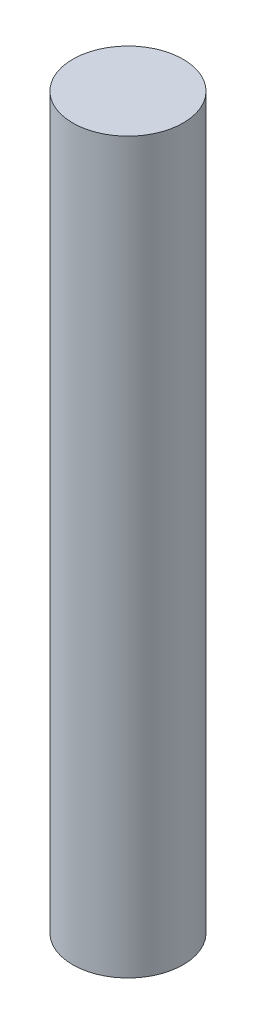
ISO-10303-21;
HEADER;
FILE_DESCRIPTION(('STEP AP214'),'2;1');
FILE_NAME('part.step','',(''),(''),'','','');
FILE_SCHEMA(('AUTOMOTIVE_DESIGN { 1 0 10303 214 1 1 1 1 }'));
ENDSEC;
DATA;
#1=APPLICATION_CONTEXT('core data for automotive mechanical design processes');
#2=APPLICATION_PROTOCOL_DEFINITION('international standard','automotive_design',2000,#1);
#3=PRODUCT_CONTEXT('',#1,'mechanical');
#4=PRODUCT('Part','Part','',(#3));
#5=PRODUCT_RELATED_PRODUCT_CATEGORY('part','',(#4));
#6=PRODUCT_DEFINITION_FORMATION('','',#4);
#7=PRODUCT_DEFINITION_CONTEXT('part definition',#1,'design');
#8=PRODUCT_DEFINITION('design','',#6,#7);
#9=PRODUCT_DEFINITION_SHAPE('','',#8);
#10=(LENGTH_UNIT() NAMED_UNIT(*) SI_UNIT(.MILLI.,.METRE.));
#11=(NAMED_UNIT(*) PLANE_ANGLE_UNIT() SI_UNIT($,.RADIAN.));
#12=(NAMED_UNIT(*) SI_UNIT($,.STERADIAN.) SOLID_ANGLE_UNIT());
#13=UNCERTAINTY_MEASURE_WITH_UNIT(LENGTH_MEASURE(1.E-05),#10,'distance_accuracy_value','');
#14=(GEOMETRIC_REPRESENTATION_CONTEXT(3) GLOBAL_UNCERTAINTY_ASSIGNED_CONTEXT((#13)) GLOBAL_UNIT_ASSIGNED_CONTEXT((#10,
#11,#12)) REPRESENTATION_CONTEXT('',''));
#15=CARTESIAN_POINT('',(0.,0.,0.));
#16=DIRECTION('',(0.,0.,1.));
#17=DIRECTION('',(1.,0.,0.));
#18=AXIS2_PLACEMENT_3D('',#15,#16,#17);
#19=CARTESIAN_POINT('',(0.,33.,0.));
#20=DIRECTION('',(0.,-1.,0.));
#21=DIRECTION('',(0.,0.,-1.));
#22=AXIS2_PLACEMENT_3D('',#19,#20,#21);
#23=CYLINDRICAL_SURFACE('',#22,2.5);
#24=CARTESIAN_POINT('',(0.,33.,0.));
#25=DIRECTION('',(0.,1.,0.));
#26=DIRECTION('',(0.,0.,1.));
#27=AXIS2_PLACEMENT_3D('',#24,#25,#26);
#28=CIRCLE('',#27,2.5);
#29=CARTESIAN_POINT('',(0.,33.,2.5));
#30=VERTEX_POINT('',#29);
#31=EDGE_CURVE('E10',#30,#30,#28,.T.);
#32=ORIENTED_EDGE('',*,*,#31,.F.);
#33=EDGE_LOOP('',(#32));
#34=FACE_BOUND('',#33,.T.);
#35=CARTESIAN_POINT('',(0.,0.,0.));
#36=DIRECTION('',(0.,1.,0.));
#37=DIRECTION('',(0.,0.,1.));
#38=AXIS2_PLACEMENT_3D('',#35,#36,#37);
#39=CIRCLE('',#38,2.5);
#40=CARTESIAN_POINT('',(0.,0.,2.5));
#41=VERTEX_POINT('',#40);
#42=EDGE_CURVE('E34',#41,#41,#39,.T.);
#43=ORIENTED_EDGE('',*,*,#42,.T.);
#44=EDGE_LOOP('',(#43));
#45=FACE_BOUND('',#44,.T.);
#46=ADVANCED_FACE('F31',(#34,#45),#23,.T.);
#47=CARTESIAN_POINT('',(0.,33.,0.));
#48=DIRECTION('',(0.,1.,0.));
#49=DIRECTION('',(0.,0.,1.));
#50=AXIS2_PLACEMENT_3D('',#47,#48,#49);
#51=PLANE('',#50);
#52=ORIENTED_EDGE('',*,*,#31,.T.);
#53=EDGE_LOOP('',(#52));
#54=FACE_BOUND('',#53,.T.);
#55=ADVANCED_FACE('F46',(#54),#51,.T.);
#56=CARTESIAN_POINT('',(0.,0.,0.));
#57=DIRECTION('',(0.,1.,0.));
#58=DIRECTION('',(0.,0.,1.));
#59=AXIS2_PLACEMENT_3D('',#56,#57,#58);
#60=PLANE('',#59);
#61=ORIENTED_EDGE('',*,*,#42,.F.);
#62=EDGE_LOOP('',(#61));
#63=FACE_BOUND('',#62,.T.);
#64=ADVANCED_FACE('F44',(#63),#60,.F.);
#65=CLOSED_SHELL('',(#46,#55,#64));
#66=MANIFOLD_SOLID_BREP('B2',#65);
#67=ADVANCED_BREP_SHAPE_REPRESENTATION('',(#18,#66),#14);
#68=SHAPE_DEFINITION_REPRESENTATION(#9,#67);
ENDSEC;
END-ISO-10303-21;
